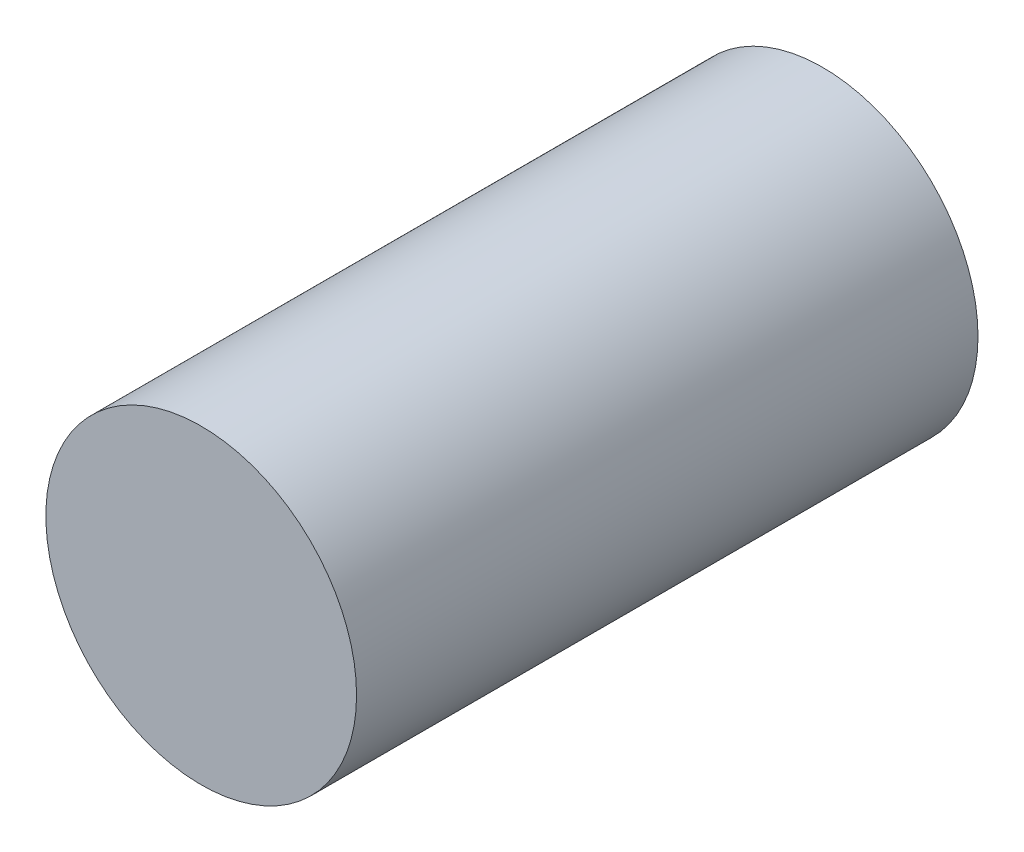
ISO-10303-21;
HEADER;
FILE_DESCRIPTION(('STEP AP214'),'2;1');
FILE_NAME('part.step','',(''),(''),'','','');
FILE_SCHEMA(('AUTOMOTIVE_DESIGN { 1 0 10303 214 1 1 1 1 }'));
ENDSEC;
DATA;
#1=APPLICATION_CONTEXT('core data for automotive mechanical design processes');
#2=APPLICATION_PROTOCOL_DEFINITION('international standard','automotive_design',2000,#1);
#3=PRODUCT_CONTEXT('',#1,'mechanical');
#4=PRODUCT('Part','Part','',(#3));
#5=PRODUCT_RELATED_PRODUCT_CATEGORY('part','',(#4));
#6=PRODUCT_DEFINITION_FORMATION('','',#4);
#7=PRODUCT_DEFINITION_CONTEXT('part definition',#1,'design');
#8=PRODUCT_DEFINITION('design','',#6,#7);
#9=PRODUCT_DEFINITION_SHAPE('','',#8);
#10=(LENGTH_UNIT() NAMED_UNIT(*) SI_UNIT(.MILLI.,.METRE.));
#11=(NAMED_UNIT(*) PLANE_ANGLE_UNIT() SI_UNIT($,.RADIAN.));
#12=(NAMED_UNIT(*) SI_UNIT($,.STERADIAN.) SOLID_ANGLE_UNIT());
#13=UNCERTAINTY_MEASURE_WITH_UNIT(LENGTH_MEASURE(1.E-05),#10,'distance_accuracy_value','');
#14=(GEOMETRIC_REPRESENTATION_CONTEXT(3) GLOBAL_UNCERTAINTY_ASSIGNED_CONTEXT((#13)) GLOBAL_UNIT_ASSIGNED_CONTEXT((#10,
#11,#12)) REPRESENTATION_CONTEXT('',''));
#15=CARTESIAN_POINT('',(0.,0.,0.));
#16=DIRECTION('',(0.,0.,1.));
#17=DIRECTION('',(1.,0.,0.));
#18=AXIS2_PLACEMENT_3D('',#15,#16,#17);
#19=CARTESIAN_POINT('',(0.,0.,60.));
#20=DIRECTION('',(0.,0.,-1.));
#21=DIRECTION('',(-1.,0.,0.));
#22=AXIS2_PLACEMENT_3D('',#19,#20,#21);
#23=CYLINDRICAL_SURFACE('',#22,15.);
#24=CARTESIAN_POINT('',(0.,0.,60.));
#25=DIRECTION('',(0.,0.,1.));
#26=DIRECTION('',(1.,0.,0.));
#27=AXIS2_PLACEMENT_3D('',#24,#25,#26);
#28=CIRCLE('',#27,15.);
#29=CARTESIAN_POINT('',(15.,0.,60.));
#30=VERTEX_POINT('',#29);
#31=EDGE_CURVE('E10',#30,#30,#28,.T.);
#32=ORIENTED_EDGE('',*,*,#31,.F.);
#33=EDGE_LOOP('',(#32));
#34=FACE_BOUND('',#33,.T.);
#35=CARTESIAN_POINT('',(0.,0.,0.));
#36=DIRECTION('',(0.,0.,1.));
#37=DIRECTION('',(1.,0.,0.));
#38=AXIS2_PLACEMENT_3D('',#35,#36,#37);
#39=CIRCLE('',#38,15.);
#40=CARTESIAN_POINT('',(15.,0.,0.));
#41=VERTEX_POINT('',#40);
#42=EDGE_CURVE('E38',#41,#41,#39,.T.);
#43=ORIENTED_EDGE('',*,*,#42,.T.);
#44=EDGE_LOOP('',(#43));
#45=FACE_BOUND('',#44,.T.);
#46=ADVANCED_FACE('F35',(#34,#45),#23,.T.);
#47=CARTESIAN_POINT('',(0.,0.,60.));
#48=DIRECTION('',(0.,0.,1.));
#49=DIRECTION('',(1.,0.,0.));
#50=AXIS2_PLACEMENT_3D('',#47,#48,#49);
#51=PLANE('',#50);
#52=ORIENTED_EDGE('',*,*,#31,.T.);
#53=EDGE_LOOP('',(#52));
#54=FACE_BOUND('',#53,.T.);
#55=ADVANCED_FACE('F50',(#54),#51,.T.);
#56=CARTESIAN_POINT('',(0.,0.,0.));
#57=DIRECTION('',(0.,0.,1.));
#58=DIRECTION('',(1.,0.,0.));
#59=AXIS2_PLACEMENT_3D('',#56,#57,#58);
#60=PLANE('',#59);
#61=ORIENTED_EDGE('',*,*,#42,.F.);
#62=EDGE_LOOP('',(#61));
#63=FACE_BOUND('',#62,.T.);
#64=ADVANCED_FACE('F48',(#63),#60,.F.);
#65=CLOSED_SHELL('',(#46,#55,#64));
#66=MANIFOLD_SOLID_BREP('B2',#65);
#67=ADVANCED_BREP_SHAPE_REPRESENTATION('',(#18,#66),#14);
#68=SHAPE_DEFINITION_REPRESENTATION(#9,#67);
ENDSEC;
END-ISO-10303-21;
